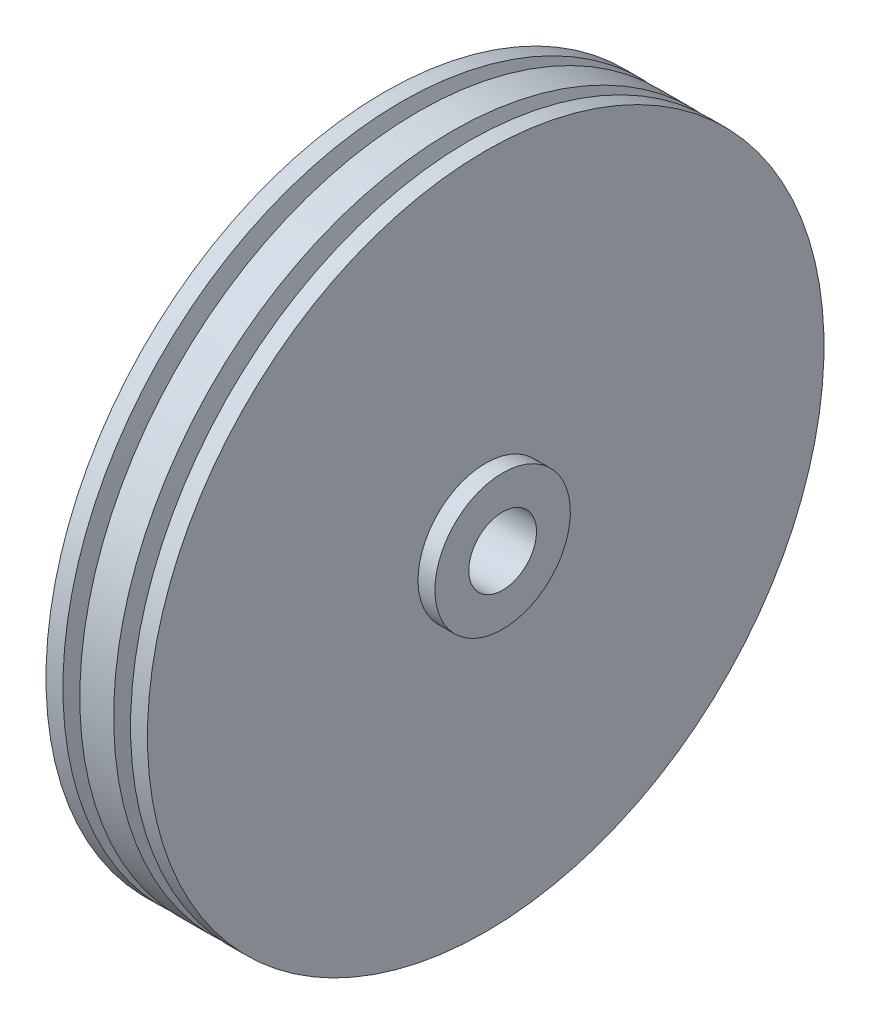
ISO-10303-21;
HEADER;
FILE_DESCRIPTION(('STEP AP214'),'2;1');
FILE_NAME('part.step','',(''),(''),'','','');
FILE_SCHEMA(('AUTOMOTIVE_DESIGN { 1 0 10303 214 1 1 1 1 }'));
ENDSEC;
DATA;
#1=APPLICATION_CONTEXT('core data for automotive mechanical design processes');
#2=APPLICATION_PROTOCOL_DEFINITION('international standard','automotive_design',2000,#1);
#3=PRODUCT_CONTEXT('',#1,'mechanical');
#4=PRODUCT('Part','Part','',(#3));
#5=PRODUCT_RELATED_PRODUCT_CATEGORY('part','',(#4));
#6=PRODUCT_DEFINITION_FORMATION('','',#4);
#7=PRODUCT_DEFINITION_CONTEXT('part definition',#1,'design');
#8=PRODUCT_DEFINITION('design','',#6,#7);
#9=PRODUCT_DEFINITION_SHAPE('','',#8);
#10=(LENGTH_UNIT() NAMED_UNIT(*) SI_UNIT(.MILLI.,.METRE.));
#11=(NAMED_UNIT(*) PLANE_ANGLE_UNIT() SI_UNIT($,.RADIAN.));
#12=(NAMED_UNIT(*) SI_UNIT($,.STERADIAN.) SOLID_ANGLE_UNIT());
#13=UNCERTAINTY_MEASURE_WITH_UNIT(LENGTH_MEASURE(1.E-05),#10,'distance_accuracy_value','');
#14=(GEOMETRIC_REPRESENTATION_CONTEXT(3) GLOBAL_UNCERTAINTY_ASSIGNED_CONTEXT((#13)) GLOBAL_UNIT_ASSIGNED_CONTEXT((#10,
#11,#12)) REPRESENTATION_CONTEXT('',''));
#15=CARTESIAN_POINT('',(0.,0.,0.));
#16=DIRECTION('',(0.,0.,1.));
#17=DIRECTION('',(1.,0.,0.));
#18=AXIS2_PLACEMENT_3D('',#15,#16,#17);
#19=CARTESIAN_POINT('',(-15.224198292623,10.0164129397258,0.));
#20=DIRECTION('',(1.,0.,0.));
#21=DIRECTION('',(0.,1.,0.));
#22=AXIS2_PLACEMENT_3D('',#19,#20,#21);
#23=PLANE('',#22);
#24=CARTESIAN_POINT('',(-15.224198292623,0.,0.));
#25=DIRECTION('',(1.,0.,0.));
#26=DIRECTION('',(0.,1.,0.));
#27=AXIS2_PLACEMENT_3D('',#24,#25,#26);
#28=CIRCLE('',#27,20.0164129397258);
#29=CARTESIAN_POINT('',(-15.224198292623,20.0164129397258,0.));
#30=VERTEX_POINT('',#29);
#31=EDGE_CURVE('E10',#30,#30,#28,.T.);
#32=ORIENTED_EDGE('',*,*,#31,.T.);
#33=EDGE_LOOP('',(#32));
#34=FACE_BOUND('',#33,.T.);
#35=CARTESIAN_POINT('',(-15.224198292623,0.,0.));
#36=DIRECTION('',(1.,0.,0.));
#37=DIRECTION('',(0.,1.,0.));
#38=AXIS2_PLACEMENT_3D('',#35,#36,#37);
#39=CIRCLE('',#38,10.0164129397258);
#40=CARTESIAN_POINT('',(-15.224198292623,10.0164129397258,0.));
#41=VERTEX_POINT('',#40);
#42=EDGE_CURVE('E84',#41,#41,#39,.T.);
#43=ORIENTED_EDGE('',*,*,#42,.F.);
#44=EDGE_LOOP('',(#43));
#45=FACE_BOUND('',#44,.T.);
#46=ADVANCED_FACE('F32',(#34,#45),#23,.T.);
#47=CARTESIAN_POINT('',(68.9055825623334,0.,0.));
#48=DIRECTION('',(1.,0.,0.));
#49=DIRECTION('',(0.,1.,0.));
#50=AXIS2_PLACEMENT_3D('',#47,#48,#49);
#51=CYLINDRICAL_SURFACE('',#50,20.0164129397258);
#52=CARTESIAN_POINT('',(-20.224198292623,0.,0.));
#53=DIRECTION('',(1.,0.,0.));
#54=DIRECTION('',(0.,1.,0.));
#55=AXIS2_PLACEMENT_3D('',#52,#53,#54);
#56=CIRCLE('',#55,20.0164129397258);
#57=CARTESIAN_POINT('',(-20.224198292623,20.0164129397258,0.));
#58=VERTEX_POINT('',#57);
#59=EDGE_CURVE('E38',#58,#58,#56,.T.);
#60=ORIENTED_EDGE('',*,*,#59,.T.);
#61=EDGE_LOOP('',(#60));
#62=FACE_BOUND('',#61,.T.);
#63=ORIENTED_EDGE('',*,*,#31,.F.);
#64=EDGE_LOOP('',(#63));
#65=FACE_BOUND('',#64,.T.);
#66=ADVANCED_FACE('F92',(#62,#65),#51,.T.);
#67=CARTESIAN_POINT('',(-20.224198292623,80.0164129397258,0.));
#68=DIRECTION('',(1.,0.,0.));
#69=DIRECTION('',(0.,1.,0.));
#70=AXIS2_PLACEMENT_3D('',#67,#68,#69);
#71=PLANE('',#70);
#72=CARTESIAN_POINT('',(-20.224198292623,0.,0.));
#73=DIRECTION('',(1.,0.,0.));
#74=DIRECTION('',(0.,1.,0.));
#75=AXIS2_PLACEMENT_3D('',#72,#73,#74);
#76=CIRCLE('',#75,100.016412939726);
#77=CARTESIAN_POINT('',(-20.224198292623,100.016412939726,0.));
#78=VERTEX_POINT('',#77);
#79=EDGE_CURVE('E42',#78,#78,#76,.T.);
#80=ORIENTED_EDGE('',*,*,#79,.T.);
#81=EDGE_LOOP('',(#80));
#82=FACE_BOUND('',#81,.T.);
#83=ORIENTED_EDGE('',*,*,#59,.F.);
#84=EDGE_LOOP('',(#83));
#85=FACE_BOUND('',#84,.T.);
#86=ADVANCED_FACE('F96',(#82,#85),#71,.T.);
#87=CARTESIAN_POINT('',(68.9055825623334,0.,0.));
#88=DIRECTION('',(1.,0.,0.));
#89=DIRECTION('',(0.,1.,0.));
#90=AXIS2_PLACEMENT_3D('',#87,#88,#89);
#91=CYLINDRICAL_SURFACE('',#90,100.016412939726);
#92=CARTESIAN_POINT('',(-25.224198292623,0.,0.));
#93=DIRECTION('',(1.,0.,0.));
#94=DIRECTION('',(0.,1.,0.));
#95=AXIS2_PLACEMENT_3D('',#92,#93,#94);
#96=CIRCLE('',#95,100.016412939726);
#97=CARTESIAN_POINT('',(-25.224198292623,100.016412939726,0.));
#98=VERTEX_POINT('',#97);
#99=EDGE_CURVE('E46',#98,#98,#96,.T.);
#100=ORIENTED_EDGE('',*,*,#99,.T.);
#101=EDGE_LOOP('',(#100));
#102=FACE_BOUND('',#101,.T.);
#103=ORIENTED_EDGE('',*,*,#79,.F.);
#104=EDGE_LOOP('',(#103));
#105=FACE_BOUND('',#104,.T.);
#106=ADVANCED_FACE('F100',(#102,#105),#91,.T.);
#107=CARTESIAN_POINT('',(-25.224198292623,0.,0.));
#108=DIRECTION('',(1.,0.,0.));
#109=DIRECTION('',(0.,1.,0.));
#110=AXIS2_PLACEMENT_3D('',#107,#108,#109);
#111=CONICAL_SURFACE('',#110,100.016412939726,1.32581766366803);
#112=CARTESIAN_POINT('',(-27.724198292623,0.,0.));
#113=DIRECTION('',(1.,0.,0.));
#114=DIRECTION('',(0.,1.,0.));
#115=AXIS2_PLACEMENT_3D('',#112,#113,#114);
#116=CIRCLE('',#115,90.0164129397258);
#117=CARTESIAN_POINT('',(-27.724198292623,90.0164129397258,0.));
#118=VERTEX_POINT('',#117);
#119=EDGE_CURVE('E51',#118,#118,#116,.T.);
#120=ORIENTED_EDGE('',*,*,#119,.T.);
#121=EDGE_LOOP('',(#120));
#122=FACE_BOUND('',#121,.T.);
#123=ORIENTED_EDGE('',*,*,#99,.F.);
#124=EDGE_LOOP('',(#123));
#125=FACE_BOUND('',#124,.T.);
#126=ADVANCED_FACE('F107',(#122,#125),#111,.T.);
#127=CARTESIAN_POINT('',(-27.724198292623,0.,0.));
#128=DIRECTION('',(-1.,0.,0.));
#129=DIRECTION('',(0.,-1.,0.));
#130=AXIS2_PLACEMENT_3D('',#127,#128,#129);
#131=CONICAL_SURFACE('',#130,90.0164129397258,1.32581766366803);
#132=CARTESIAN_POINT('',(-30.2241982926231,0.,0.));
#133=DIRECTION('',(1.,0.,0.));
#134=DIRECTION('',(0.,1.,0.));
#135=AXIS2_PLACEMENT_3D('',#132,#133,#134);
#136=CIRCLE('',#135,100.016412939726);
#137=CARTESIAN_POINT('',(-30.2241982926231,100.016412939726,0.));
#138=VERTEX_POINT('',#137);
#139=EDGE_CURVE('E54',#138,#138,#136,.T.);
#140=ORIENTED_EDGE('',*,*,#139,.T.);
#141=EDGE_LOOP('',(#140));
#142=FACE_BOUND('',#141,.T.);
#143=ORIENTED_EDGE('',*,*,#119,.F.);
#144=EDGE_LOOP('',(#143));
#145=FACE_BOUND('',#144,.T.);
#146=ADVANCED_FACE('F111',(#142,#145),#131,.T.);
#147=CARTESIAN_POINT('',(68.9055825623334,0.,0.));
#148=DIRECTION('',(1.,0.,0.));
#149=DIRECTION('',(0.,1.,0.));
#150=AXIS2_PLACEMENT_3D('',#147,#148,#149);
#151=CYLINDRICAL_SURFACE('',#150,100.016412939726);
#152=CARTESIAN_POINT('',(-40.2241982926229,0.,0.));
#153=DIRECTION('',(1.,0.,0.));
#154=DIRECTION('',(0.,1.,0.));
#155=AXIS2_PLACEMENT_3D('',#152,#153,#154);
#156=CIRCLE('',#155,100.016412939726);
#157=CARTESIAN_POINT('',(-40.2241982926229,100.016412939726,0.));
#158=VERTEX_POINT('',#157);
#159=EDGE_CURVE('E57',#158,#158,#156,.T.);
#160=ORIENTED_EDGE('',*,*,#159,.T.);
#161=EDGE_LOOP('',(#160));
#162=FACE_BOUND('',#161,.T.);
#163=ORIENTED_EDGE('',*,*,#139,.F.);
#164=EDGE_LOOP('',(#163));
#165=FACE_BOUND('',#164,.T.);
#166=ADVANCED_FACE('F115',(#162,#165),#151,.T.);
#167=CARTESIAN_POINT('',(-40.2241982926229,0.,0.));
#168=DIRECTION('',(1.,0.,0.));
#169=DIRECTION('',(0.,1.,0.));
#170=AXIS2_PLACEMENT_3D('',#167,#168,#169);
#171=CONICAL_SURFACE('',#170,100.016412939726,1.32581766366803);
#172=CARTESIAN_POINT('',(-42.724198292623,0.,0.));
#173=DIRECTION('',(1.,0.,0.));
#174=DIRECTION('',(0.,1.,0.));
#175=AXIS2_PLACEMENT_3D('',#172,#173,#174);
#176=CIRCLE('',#175,90.0164129397258);
#177=CARTESIAN_POINT('',(-42.724198292623,90.0164129397258,0.));
#178=VERTEX_POINT('',#177);
#179=EDGE_CURVE('E60',#178,#178,#176,.T.);
#180=ORIENTED_EDGE('',*,*,#179,.T.);
#181=EDGE_LOOP('',(#180));
#182=FACE_BOUND('',#181,.T.);
#183=ORIENTED_EDGE('',*,*,#159,.F.);
#184=EDGE_LOOP('',(#183));
#185=FACE_BOUND('',#184,.T.);
#186=ADVANCED_FACE('F119',(#182,#185),#171,.T.);
#187=CARTESIAN_POINT('',(-42.724198292623,0.,0.));
#188=DIRECTION('',(-1.,0.,0.));
#189=DIRECTION('',(0.,-1.,0.));
#190=AXIS2_PLACEMENT_3D('',#187,#188,#189);
#191=CONICAL_SURFACE('',#190,90.0164129397258,1.32581766366803);
#192=CARTESIAN_POINT('',(-45.2241982926231,0.,0.));
#193=DIRECTION('',(1.,0.,0.));
#194=DIRECTION('',(0.,1.,0.));
#195=AXIS2_PLACEMENT_3D('',#192,#193,#194);
#196=CIRCLE('',#195,100.016412939726);
#197=CARTESIAN_POINT('',(-45.2241982926231,100.016412939726,0.));
#198=VERTEX_POINT('',#197);
#199=EDGE_CURVE('E63',#198,#198,#196,.T.);
#200=ORIENTED_EDGE('',*,*,#199,.T.);
#201=EDGE_LOOP('',(#200));
#202=FACE_BOUND('',#201,.T.);
#203=ORIENTED_EDGE('',*,*,#179,.F.);
#204=EDGE_LOOP('',(#203));
#205=FACE_BOUND('',#204,.T.);
#206=ADVANCED_FACE('F123',(#202,#205),#191,.T.);
#207=CARTESIAN_POINT('',(68.9055825623334,0.,0.));
#208=DIRECTION('',(1.,0.,0.));
#209=DIRECTION('',(0.,1.,0.));
#210=AXIS2_PLACEMENT_3D('',#207,#208,#209);
#211=CYLINDRICAL_SURFACE('',#210,100.016412939726);
#212=CARTESIAN_POINT('',(-50.224198292623,0.,0.));
#213=DIRECTION('',(1.,0.,0.));
#214=DIRECTION('',(0.,1.,0.));
#215=AXIS2_PLACEMENT_3D('',#212,#213,#214);
#216=CIRCLE('',#215,100.016412939726);
#217=CARTESIAN_POINT('',(-50.224198292623,100.016412939726,0.));
#218=VERTEX_POINT('',#217);
#219=EDGE_CURVE('E66',#218,#218,#216,.T.);
#220=ORIENTED_EDGE('',*,*,#219,.T.);
#221=EDGE_LOOP('',(#220));
#222=FACE_BOUND('',#221,.T.);
#223=ORIENTED_EDGE('',*,*,#199,.F.);
#224=EDGE_LOOP('',(#223));
#225=FACE_BOUND('',#224,.T.);
#226=ADVANCED_FACE('F127',(#222,#225),#211,.T.);
#227=CARTESIAN_POINT('',(-50.224198292623,100.016412939726,0.));
#228=DIRECTION('',(-1.,0.,0.));
#229=DIRECTION('',(0.,-1.,0.));
#230=AXIS2_PLACEMENT_3D('',#227,#228,#229);
#231=PLANE('',#230);
#232=CARTESIAN_POINT('',(-50.224198292623,0.,0.));
#233=DIRECTION('',(1.,0.,0.));
#234=DIRECTION('',(0.,1.,0.));
#235=AXIS2_PLACEMENT_3D('',#232,#233,#234);
#236=CIRCLE('',#235,80.016412939728);
#237=CARTESIAN_POINT('',(-50.224198292623,80.016412939728,0.));
#238=VERTEX_POINT('',#237);
#239=EDGE_CURVE('E69',#238,#238,#236,.T.);
#240=ORIENTED_EDGE('',*,*,#239,.T.);
#241=EDGE_LOOP('',(#240));
#242=FACE_BOUND('',#241,.T.);
#243=ORIENTED_EDGE('',*,*,#219,.F.);
#244=EDGE_LOOP('',(#243));
#245=FACE_BOUND('',#244,.T.);
#246=ADVANCED_FACE('F131',(#242,#245),#231,.T.);
#247=CARTESIAN_POINT('',(68.9055825623334,0.,0.));
#248=DIRECTION('',(1.,0.,0.));
#249=DIRECTION('',(0.,1.,0.));
#250=AXIS2_PLACEMENT_3D('',#247,#248,#249);
#251=CYLINDRICAL_SURFACE('',#250,80.016412939728);
#252=CARTESIAN_POINT('',(-30.224198292623,0.,0.));
#253=DIRECTION('',(1.,0.,0.));
#254=DIRECTION('',(0.,1.,0.));
#255=AXIS2_PLACEMENT_3D('',#252,#253,#254);
#256=CIRCLE('',#255,80.016412939728);
#257=CARTESIAN_POINT('',(-30.224198292623,80.016412939728,0.));
#258=VERTEX_POINT('',#257);
#259=EDGE_CURVE('E72',#258,#258,#256,.T.);
#260=ORIENTED_EDGE('',*,*,#259,.T.);
#261=EDGE_LOOP('',(#260));
#262=FACE_BOUND('',#261,.T.);
#263=ORIENTED_EDGE('',*,*,#239,.F.);
#264=EDGE_LOOP('',(#263));
#265=FACE_BOUND('',#264,.T.);
#266=ADVANCED_FACE('F135',(#262,#265),#251,.F.);
#267=CARTESIAN_POINT('',(-30.224198292623,20.0164129397258,0.));
#268=DIRECTION('',(-1.,0.,0.));
#269=DIRECTION('',(0.,-1.,0.));
#270=AXIS2_PLACEMENT_3D('',#267,#268,#269);
#271=PLANE('',#270);
#272=CARTESIAN_POINT('',(-30.224198292623,0.,0.));
#273=DIRECTION('',(1.,0.,0.));
#274=DIRECTION('',(0.,1.,0.));
#275=AXIS2_PLACEMENT_3D('',#272,#273,#274);
#276=CIRCLE('',#275,20.0164129397258);
#277=CARTESIAN_POINT('',(-30.224198292623,20.0164129397258,0.));
#278=VERTEX_POINT('',#277);
#279=EDGE_CURVE('E75',#278,#278,#276,.T.);
#280=ORIENTED_EDGE('',*,*,#279,.T.);
#281=EDGE_LOOP('',(#280));
#282=FACE_BOUND('',#281,.T.);
#283=ORIENTED_EDGE('',*,*,#259,.F.);
#284=EDGE_LOOP('',(#283));
#285=FACE_BOUND('',#284,.T.);
#286=ADVANCED_FACE('F139',(#282,#285),#271,.T.);
#287=CARTESIAN_POINT('',(68.9055825623334,0.,0.));
#288=DIRECTION('',(1.,0.,0.));
#289=DIRECTION('',(0.,1.,0.));
#290=AXIS2_PLACEMENT_3D('',#287,#288,#289);
#291=CYLINDRICAL_SURFACE('',#290,20.0164129397258);
#292=CARTESIAN_POINT('',(-35.224198292623,0.,0.));
#293=DIRECTION('',(1.,0.,0.));
#294=DIRECTION('',(0.,1.,0.));
#295=AXIS2_PLACEMENT_3D('',#292,#293,#294);
#296=CIRCLE('',#295,20.0164129397258);
#297=CARTESIAN_POINT('',(-35.224198292623,20.0164129397258,0.));
#298=VERTEX_POINT('',#297);
#299=EDGE_CURVE('E78',#298,#298,#296,.T.);
#300=ORIENTED_EDGE('',*,*,#299,.T.);
#301=EDGE_LOOP('',(#300));
#302=FACE_BOUND('',#301,.T.);
#303=ORIENTED_EDGE('',*,*,#279,.F.);
#304=EDGE_LOOP('',(#303));
#305=FACE_BOUND('',#304,.T.);
#306=ADVANCED_FACE('F143',(#302,#305),#291,.T.);
#307=CARTESIAN_POINT('',(-35.224198292623,10.0164129397258,0.));
#308=DIRECTION('',(-1.,0.,0.));
#309=DIRECTION('',(0.,-1.,0.));
#310=AXIS2_PLACEMENT_3D('',#307,#308,#309);
#311=PLANE('',#310);
#312=CARTESIAN_POINT('',(-35.224198292623,0.,0.));
#313=DIRECTION('',(1.,0.,0.));
#314=DIRECTION('',(0.,1.,0.));
#315=AXIS2_PLACEMENT_3D('',#312,#313,#314);
#316=CIRCLE('',#315,10.0164129397258);
#317=CARTESIAN_POINT('',(-35.224198292623,10.0164129397258,0.));
#318=VERTEX_POINT('',#317);
#319=EDGE_CURVE('E81',#318,#318,#316,.T.);
#320=ORIENTED_EDGE('',*,*,#319,.T.);
#321=EDGE_LOOP('',(#320));
#322=FACE_BOUND('',#321,.T.);
#323=ORIENTED_EDGE('',*,*,#299,.F.);
#324=EDGE_LOOP('',(#323));
#325=FACE_BOUND('',#324,.T.);
#326=ADVANCED_FACE('F147',(#322,#325),#311,.T.);
#327=CARTESIAN_POINT('',(68.9055825623334,0.,0.));
#328=DIRECTION('',(1.,0.,0.));
#329=DIRECTION('',(0.,1.,0.));
#330=AXIS2_PLACEMENT_3D('',#327,#328,#329);
#331=CYLINDRICAL_SURFACE('',#330,10.0164129397258);
#332=ORIENTED_EDGE('',*,*,#42,.T.);
#333=EDGE_LOOP('',(#332));
#334=FACE_BOUND('',#333,.T.);
#335=ORIENTED_EDGE('',*,*,#319,.F.);
#336=EDGE_LOOP('',(#335));
#337=FACE_BOUND('',#336,.T.);
#338=ADVANCED_FACE('F88',(#334,#337),#331,.F.);
#339=CLOSED_SHELL('',(#46,#66,#86,#106,#126,#146,#166,#186,#206,#226,#246,#266,#286,#306,#326,#338));
#340=MANIFOLD_SOLID_BREP('B2',#339);
#341=ADVANCED_BREP_SHAPE_REPRESENTATION('',(#18,#340),#14);
#342=SHAPE_DEFINITION_REPRESENTATION(#9,#341);
ENDSEC;
END-ISO-10303-21;
